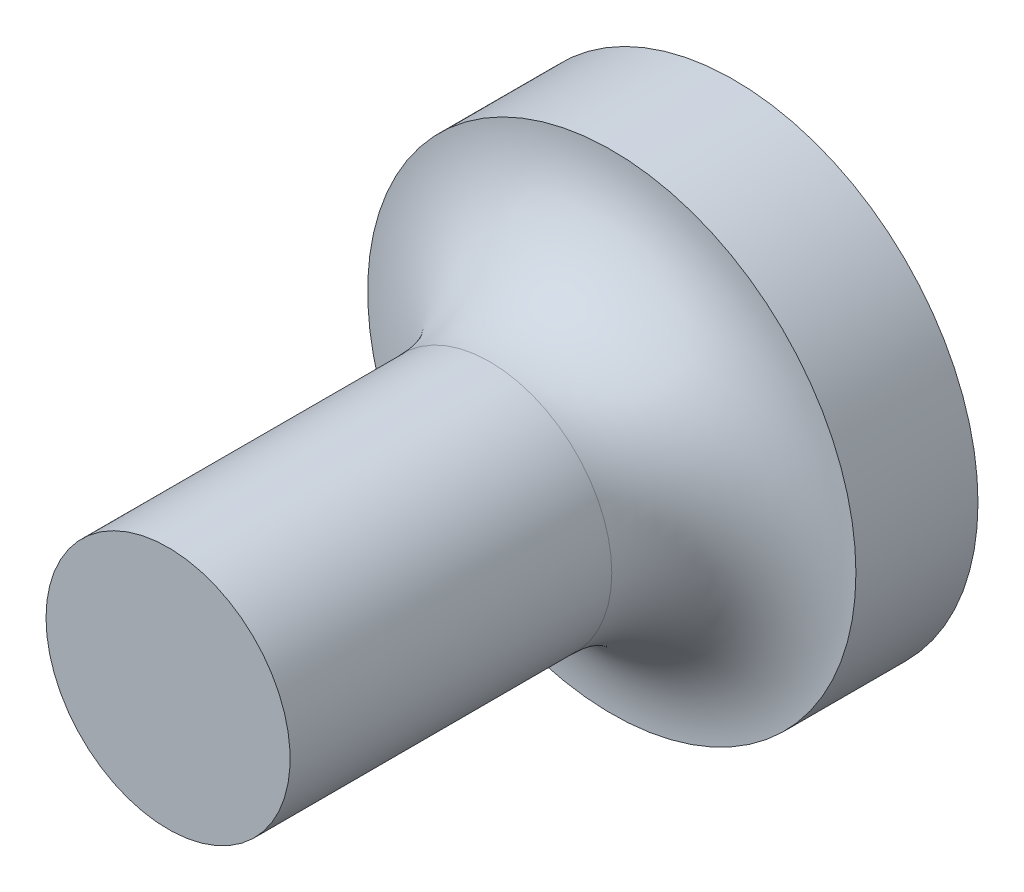
ISO-10303-21;
HEADER;
FILE_DESCRIPTION(('STEP AP214'),'2;1');
FILE_NAME('part.step','',(''),(''),'','','');
FILE_SCHEMA(('AUTOMOTIVE_DESIGN { 1 0 10303 214 1 1 1 1 }'));
ENDSEC;
DATA;
#1=APPLICATION_CONTEXT('core data for automotive mechanical design processes');
#2=APPLICATION_PROTOCOL_DEFINITION('international standard','automotive_design',2000,#1);
#3=PRODUCT_CONTEXT('',#1,'mechanical');
#4=PRODUCT('Part','Part','',(#3));
#5=PRODUCT_RELATED_PRODUCT_CATEGORY('part','',(#4));
#6=PRODUCT_DEFINITION_FORMATION('','',#4);
#7=PRODUCT_DEFINITION_CONTEXT('part definition',#1,'design');
#8=PRODUCT_DEFINITION('design','',#6,#7);
#9=PRODUCT_DEFINITION_SHAPE('','',#8);
#10=(LENGTH_UNIT() NAMED_UNIT(*) SI_UNIT(.MILLI.,.METRE.));
#11=(NAMED_UNIT(*) PLANE_ANGLE_UNIT() SI_UNIT($,.RADIAN.));
#12=(NAMED_UNIT(*) SI_UNIT($,.STERADIAN.) SOLID_ANGLE_UNIT());
#13=UNCERTAINTY_MEASURE_WITH_UNIT(LENGTH_MEASURE(1.E-05),#10,'distance_accuracy_value','');
#14=(GEOMETRIC_REPRESENTATION_CONTEXT(3) GLOBAL_UNCERTAINTY_ASSIGNED_CONTEXT((#13)) GLOBAL_UNIT_ASSIGNED_CONTEXT((#10,
#11,#12)) REPRESENTATION_CONTEXT('',''));
#15=CARTESIAN_POINT('',(0.,0.,0.));
#16=DIRECTION('',(0.,0.,1.));
#17=DIRECTION('',(1.,0.,0.));
#18=AXIS2_PLACEMENT_3D('',#15,#16,#17);
#19=CARTESIAN_POINT('',(0.,0.,52.35));
#20=DIRECTION('',(0.,0.,-1.));
#21=DIRECTION('',(-1.,0.,0.));
#22=AXIS2_PLACEMENT_3D('',#19,#20,#21);
#23=CYLINDRICAL_SURFACE('',#22,10.);
#24=CARTESIAN_POINT('',(0.,0.,26.));
#25=DIRECTION('',(0.,0.,1.));
#26=DIRECTION('',(1.,0.,0.));
#27=AXIS2_PLACEMENT_3D('',#24,#25,#26);
#28=CIRCLE('',#27,10.);
#29=CARTESIAN_POINT('',(-10.,0.,26.));
#30=VERTEX_POINT('',#29);
#31=EDGE_CURVE('E10',#30,#30,#28,.T.);
#32=CARTESIAN_POINT('',(0.,0.,52.35));
#33=DIRECTION('',(0.,0.,1.));
#34=DIRECTION('',(1.,0.,0.));
#35=AXIS2_PLACEMENT_3D('',#32,#33,#34);
#36=CIRCLE('',#35,10.);
#37=CARTESIAN_POINT('',(-10.,0.,52.35));
#38=VERTEX_POINT('',#37);
#39=EDGE_CURVE('E54',#38,#38,#36,.T.);
#40=CARTESIAN_POINT('',(-10.,0.,26.));
#41=CARTESIAN_POINT('',(-10.,0.,26.2744791666667));
#42=CARTESIAN_POINT('',(-10.,0.,26.5489583333333));
#43=CARTESIAN_POINT('',(-10.,0.,27.0979166666667));
#44=CARTESIAN_POINT('',(-10.,0.,27.3723958333333));
#45=CARTESIAN_POINT('',(-10.,0.,27.9213541666667));
#46=CARTESIAN_POINT('',(-10.,0.,28.1958333333333));
#47=CARTESIAN_POINT('',(-10.,0.,28.7447916666667));
#48=CARTESIAN_POINT('',(-10.,0.,29.0192708333333));
#49=CARTESIAN_POINT('',(-10.,0.,29.5682291666667));
#50=CARTESIAN_POINT('',(-10.,0.,29.8427083333333));
#51=CARTESIAN_POINT('',(-10.,0.,30.3916666666667));
#52=CARTESIAN_POINT('',(-10.,0.,30.6661458333333));
#53=CARTESIAN_POINT('',(-10.,0.,31.2151041666667));
#54=CARTESIAN_POINT('',(-10.,0.,31.4895833333333));
#55=CARTESIAN_POINT('',(-10.,0.,32.0385416666667));
#56=CARTESIAN_POINT('',(-10.,0.,32.3130208333333));
#57=CARTESIAN_POINT('',(-10.,0.,32.8619791666667));
#58=CARTESIAN_POINT('',(-10.,0.,33.1364583333333));
#59=CARTESIAN_POINT('',(-10.,0.,33.6854166666667));
#60=CARTESIAN_POINT('',(-10.,0.,33.9598958333333));
#61=CARTESIAN_POINT('',(-10.,0.,34.5088541666667));
#62=CARTESIAN_POINT('',(-10.,0.,34.7833333333333));
#63=CARTESIAN_POINT('',(-10.,0.,35.3322916666667));
#64=CARTESIAN_POINT('',(-10.,0.,35.6067708333333));
#65=CARTESIAN_POINT('',(-10.,0.,36.1557291666667));
#66=CARTESIAN_POINT('',(-10.,0.,36.4302083333333));
#67=CARTESIAN_POINT('',(-10.,0.,36.9791666666667));
#68=CARTESIAN_POINT('',(-10.,0.,37.2536458333333));
#69=CARTESIAN_POINT('',(-10.,0.,37.8026041666667));
#70=CARTESIAN_POINT('',(-10.,0.,38.0770833333333));
#71=CARTESIAN_POINT('',(-10.,0.,38.6260416666667));
#72=CARTESIAN_POINT('',(-10.,0.,38.9005208333333));
#73=CARTESIAN_POINT('',(-10.,0.,39.4494791666667));
#74=CARTESIAN_POINT('',(-10.,0.,39.7239583333333));
#75=CARTESIAN_POINT('',(-10.,0.,40.2729166666667));
#76=CARTESIAN_POINT('',(-10.,0.,40.5473958333333));
#77=CARTESIAN_POINT('',(-10.,0.,41.0963541666667));
#78=CARTESIAN_POINT('',(-10.,0.,41.3708333333333));
#79=CARTESIAN_POINT('',(-10.,0.,41.9197916666667));
#80=CARTESIAN_POINT('',(-10.,0.,42.1942708333333));
#81=CARTESIAN_POINT('',(-10.,0.,42.7432291666667));
#82=CARTESIAN_POINT('',(-10.,0.,43.0177083333333));
#83=CARTESIAN_POINT('',(-10.,0.,43.5666666666667));
#84=CARTESIAN_POINT('',(-10.,0.,43.8411458333333));
#85=CARTESIAN_POINT('',(-10.,0.,44.3901041666667));
#86=CARTESIAN_POINT('',(-10.,0.,44.6645833333333));
#87=CARTESIAN_POINT('',(-10.,0.,45.2135416666667));
#88=CARTESIAN_POINT('',(-10.,0.,45.4880208333333));
#89=CARTESIAN_POINT('',(-10.,0.,46.0369791666667));
#90=CARTESIAN_POINT('',(-10.,0.,46.3114583333333));
#91=CARTESIAN_POINT('',(-10.,0.,46.8604166666667));
#92=CARTESIAN_POINT('',(-10.,0.,47.1348958333333));
#93=CARTESIAN_POINT('',(-10.,0.,47.6838541666667));
#94=CARTESIAN_POINT('',(-10.,0.,47.9583333333333));
#95=CARTESIAN_POINT('',(-10.,0.,48.5072916666667));
#96=CARTESIAN_POINT('',(-10.,0.,48.7817708333333));
#97=CARTESIAN_POINT('',(-10.,0.,49.3307291666667));
#98=CARTESIAN_POINT('',(-10.,0.,49.6052083333333));
#99=CARTESIAN_POINT('',(-10.,0.,50.1541666666667));
#100=CARTESIAN_POINT('',(-10.,0.,50.4286458333333));
#101=CARTESIAN_POINT('',(-10.,0.,50.9776041666667));
#102=CARTESIAN_POINT('',(-10.,0.,51.2520833333333));
#103=CARTESIAN_POINT('',(-10.,0.,51.8010416666667));
#104=CARTESIAN_POINT('',(-10.,0.,52.0755208333333));
#105=CARTESIAN_POINT('',(-10.,0.,52.35));
#106=B_SPLINE_CURVE_WITH_KNOTS('',3,(#40,#41,#42,#43,#44,#45,#46,#47,#48,#49,#50,#51,#52,#53,
#54,#55,#56,#57,#58,#59,#60,#61,#62,#63,#64,#65,#66,#67,#68,#69,#70,#71,#72,#73,#74,#75,#76,#77,
#78,#79,#80,#81,#82,#83,#84,#85,#86,#87,#88,#89,#90,#91,#92,#93,#94,#95,#96,#97,#98,#99,#100,
#101,#102,#103,#104,#105),.UNSPECIFIED.,.F.,.F.,(4,2,2,2,2,2,2,2,2,2,2,2,2,2,2,2,2,2,2,2,2,2,2,
2,2,2,2,2,2,2,2,2,4),(0.,0.823437499999999,1.646875,2.4703125,3.29375,4.1171875,4.940625,
5.7640625,6.5875,7.4109375,8.234375,9.0578125,9.88125,10.7046875,11.528125,12.3515625,13.175,
13.9984375,14.821875,15.6453125,16.46875,17.2921875,18.115625,18.9390625,19.7625,20.5859375,
21.409375,22.2328125,23.05625,23.8796875,24.703125,25.5265625,26.35),.UNSPECIFIED.);
#107=EDGE_CURVE('BSEAM41',#30,#38,#106,.T.);
#108=ORIENTED_EDGE('',*,*,#31,.T.);
#109=ORIENTED_EDGE('',*,*,#39,.F.);
#110=ORIENTED_EDGE('',*,*,#107,.T.);
#111=ORIENTED_EDGE('',*,*,#107,.F.);
#112=EDGE_LOOP('',(#108,#110,#109,#111));
#113=FACE_BOUND('',#112,.T.);
#114=ADVANCED_FACE('F41',(#113),#23,.T.);
#115=CARTESIAN_POINT('',(0.,0.,52.35));
#116=DIRECTION('',(0.,0.,1.));
#117=DIRECTION('',(1.,0.,0.));
#118=AXIS2_PLACEMENT_3D('',#115,#116,#117);
#119=PLANE('',#118);
#120=ORIENTED_EDGE('',*,*,#39,.T.);
#121=EDGE_LOOP('',(#120));
#122=FACE_BOUND('',#121,.T.);
#123=ADVANCED_FACE('F80',(#122),#119,.T.);
#124=CARTESIAN_POINT('',(0.,0.,16.));
#125=DIRECTION('',(0.,0.,-1.));
#126=DIRECTION('',(-1.,0.,0.));
#127=AXIS2_PLACEMENT_3D('',#124,#125,#126);
#128=CYLINDRICAL_SURFACE('',#127,20.);
#129=CARTESIAN_POINT('',(0.,0.,16.));
#130=DIRECTION('',(0.,0.,1.));
#131=DIRECTION('',(1.,0.,0.));
#132=AXIS2_PLACEMENT_3D('',#129,#130,#131);
#133=CIRCLE('',#132,20.);
#134=CARTESIAN_POINT('',(20.,0.,16.));
#135=VERTEX_POINT('',#134);
#136=EDGE_CURVE('E64',#135,#135,#133,.T.);
#137=ORIENTED_EDGE('',*,*,#136,.F.);
#138=EDGE_LOOP('',(#137));
#139=FACE_BOUND('',#138,.T.);
#140=CARTESIAN_POINT('',(0.,0.,6.));
#141=DIRECTION('',(0.,0.,1.));
#142=DIRECTION('',(1.,0.,0.));
#143=AXIS2_PLACEMENT_3D('',#140,#141,#142);
#144=CIRCLE('',#143,20.);
#145=CARTESIAN_POINT('',(20.,0.,6.));
#146=VERTEX_POINT('',#145);
#147=EDGE_CURVE('E66',#146,#146,#144,.T.);
#148=ORIENTED_EDGE('',*,*,#147,.T.);
#149=EDGE_LOOP('',(#148));
#150=FACE_BOUND('',#149,.T.);
#151=ADVANCED_FACE('F76',(#139,#150),#128,.T.);
#152=CARTESIAN_POINT('',(0.,0.,6.));
#153=DIRECTION('',(0.,0.,1.));
#154=DIRECTION('',(1.,0.,0.));
#155=AXIS2_PLACEMENT_3D('',#152,#153,#154);
#156=PLANE('',#155);
#157=CARTESIAN_POINT('',(0.,0.,6.));
#158=DIRECTION('',(0.,0.,1.));
#159=DIRECTION('',(1.,0.,0.));
#160=AXIS2_PLACEMENT_3D('',#157,#158,#159);
#161=CIRCLE('',#160,10.);
#162=CARTESIAN_POINT('',(-10.,0.,5.99999999999999));
#163=VERTEX_POINT('',#162);
#164=EDGE_CURVE('E49',#163,#163,#161,.T.);
#165=ORIENTED_EDGE('',*,*,#164,.T.);
#166=EDGE_LOOP('',(#165));
#167=FACE_BOUND('',#166,.T.);
#168=ORIENTED_EDGE('',*,*,#147,.F.);
#169=EDGE_LOOP('',(#168));
#170=FACE_BOUND('',#169,.T.);
#171=ADVANCED_FACE('F79',(#167,#170),#156,.F.);
#172=CARTESIAN_POINT('',(0.,0.,0.));
#173=DIRECTION('',(0.,0.,1.));
#174=DIRECTION('',(1.,0.,0.));
#175=AXIS2_PLACEMENT_3D('',#172,#173,#174);
#176=PLANE('',#175);
#177=CARTESIAN_POINT('',(0.,0.,0.));
#178=DIRECTION('',(0.,0.,1.));
#179=DIRECTION('',(1.,0.,0.));
#180=AXIS2_PLACEMENT_3D('',#177,#178,#179);
#181=CIRCLE('',#180,10.);
#182=CARTESIAN_POINT('',(-10.,0.,0.));
#183=VERTEX_POINT('',#182);
#184=EDGE_CURVE('E59',#183,#183,#181,.T.);
#185=ORIENTED_EDGE('',*,*,#184,.F.);
#186=EDGE_LOOP('',(#185));
#187=FACE_BOUND('',#186,.T.);
#188=ADVANCED_FACE('F85',(#187),#176,.F.);
#189=CARTESIAN_POINT('',(-10.,0.,0.));
#190=CARTESIAN_POINT('',(-10.,0.,0.0625000000000001));
#191=CARTESIAN_POINT('',(-10.,0.,0.125));
#192=CARTESIAN_POINT('',(-10.,0.,0.25));
#193=CARTESIAN_POINT('',(-10.,0.,0.3125));
#194=CARTESIAN_POINT('',(-10.,0.,0.4375));
#195=CARTESIAN_POINT('',(-10.,0.,0.5));
#196=CARTESIAN_POINT('',(-10.,0.,0.625000000000001));
#197=CARTESIAN_POINT('',(-10.,0.,0.687500000000001));
#198=CARTESIAN_POINT('',(-10.,0.,0.812500000000001));
#199=CARTESIAN_POINT('',(-10.,0.,0.875000000000001));
#200=CARTESIAN_POINT('',(-10.,0.,1.));
#201=CARTESIAN_POINT('',(-10.,0.,1.0625));
#202=CARTESIAN_POINT('',(-10.,0.,1.1875));
#203=CARTESIAN_POINT('',(-10.,0.,1.25));
#204=CARTESIAN_POINT('',(-10.,0.,1.375));
#205=CARTESIAN_POINT('',(-10.,0.,1.4375));
#206=CARTESIAN_POINT('',(-10.,0.,1.5625));
#207=CARTESIAN_POINT('',(-10.,0.,1.625));
#208=CARTESIAN_POINT('',(-10.,0.,1.74999999999999));
#209=CARTESIAN_POINT('',(-10.,0.,1.81249999999999));
#210=CARTESIAN_POINT('',(-10.,0.,1.93749999999999));
#211=CARTESIAN_POINT('',(-10.,0.,1.99999999999999));
#212=CARTESIAN_POINT('',(-10.,0.,2.125));
#213=CARTESIAN_POINT('',(-10.,0.,2.1875));
#214=CARTESIAN_POINT('',(-10.,0.,2.3125));
#215=CARTESIAN_POINT('',(-10.,0.,2.375));
#216=CARTESIAN_POINT('',(-10.,0.,2.5));
#217=CARTESIAN_POINT('',(-10.,0.,2.5625));
#218=CARTESIAN_POINT('',(-10.,0.,2.6875));
#219=CARTESIAN_POINT('',(-10.,0.,2.75));
#220=CARTESIAN_POINT('',(-10.,0.,2.875));
#221=CARTESIAN_POINT('',(-10.,0.,2.9375));
#222=CARTESIAN_POINT('',(-10.,0.,3.0625));
#223=CARTESIAN_POINT('',(-10.,0.,3.125));
#224=CARTESIAN_POINT('',(-10.,0.,3.25));
#225=CARTESIAN_POINT('',(-10.,0.,3.3125));
#226=CARTESIAN_POINT('',(-10.,0.,3.4375));
#227=CARTESIAN_POINT('',(-10.,0.,3.5));
#228=CARTESIAN_POINT('',(-10.,0.,3.625));
#229=CARTESIAN_POINT('',(-10.,0.,3.6875));
#230=CARTESIAN_POINT('',(-10.,0.,3.8125));
#231=CARTESIAN_POINT('',(-10.,0.,3.875));
#232=CARTESIAN_POINT('',(-10.,0.,4.));
#233=CARTESIAN_POINT('',(-10.,0.,4.0625));
#234=CARTESIAN_POINT('',(-10.,0.,4.1875));
#235=CARTESIAN_POINT('',(-10.,0.,4.25));
#236=CARTESIAN_POINT('',(-10.,0.,4.37499999999999));
#237=CARTESIAN_POINT('',(-10.,0.,4.43749999999999));
#238=CARTESIAN_POINT('',(-10.,0.,4.56249999999999));
#239=CARTESIAN_POINT('',(-10.,0.,4.62499999999999));
#240=CARTESIAN_POINT('',(-10.,0.,4.74999999999999));
#241=CARTESIAN_POINT('',(-10.,0.,4.81249999999999));
#242=CARTESIAN_POINT('',(-10.,0.,4.93749999999999));
#243=CARTESIAN_POINT('',(-10.,0.,4.99999999999999));
#244=CARTESIAN_POINT('',(-10.,0.,5.12499999999999));
#245=CARTESIAN_POINT('',(-10.,0.,5.18749999999999));
#246=CARTESIAN_POINT('',(-10.,0.,5.31249999999999));
#247=CARTESIAN_POINT('',(-10.,0.,5.37499999999999));
#248=CARTESIAN_POINT('',(-10.,0.,5.49999999999999));
#249=CARTESIAN_POINT('',(-10.,0.,5.56249999999999));
#250=CARTESIAN_POINT('',(-10.,0.,5.68749999999999));
#251=CARTESIAN_POINT('',(-10.,0.,5.74999999999999));
#252=CARTESIAN_POINT('',(-10.,0.,5.87499999999999));
#253=CARTESIAN_POINT('',(-10.,0.,5.93749999999999));
#254=CARTESIAN_POINT('',(-10.,0.,5.99999999999999));
#255=B_SPLINE_CURVE_WITH_KNOTS('',3,(#189,#190,#191,#192,#193,#194,#195,#196,#197,#198,#199,
#200,#201,#202,#203,#204,#205,#206,#207,#208,#209,#210,#211,#212,#213,#214,#215,#216,#217,#218,
#219,#220,#221,#222,#223,#224,#225,#226,#227,#228,#229,#230,#231,#232,#233,#234,#235,#236,#237,
#238,#239,#240,#241,#242,#243,#244,#245,#246,#247,#248,#249,#250,#251,#252,#253,#254),
.UNSPECIFIED.,.F.,.F.,(4,2,2,2,2,2,2,2,2,2,2,2,2,2,2,2,2,2,2,2,2,2,2,2,2,2,2,2,2,2,2,2,4),(0.,
0.1875,0.375,0.5625,0.750000000000001,0.937500000000001,1.125,1.3125,1.5,1.68749999999999,
1.87499999999999,2.06249999999999,2.25,2.4375,2.625,2.8125,3.,3.1875,3.375,3.5625,3.75,3.9375,
4.125,4.3125,4.49999999999999,4.6875,4.87499999999999,5.06249999999999,5.24999999999999,
5.43749999999999,5.62499999999999,5.81249999999999,5.99999999999999),.UNSPECIFIED.);
#256=EDGE_CURVE('BSEAM90',#183,#163,#255,.T.);
#257=ORIENTED_EDGE('',*,*,#184,.T.);
#258=ORIENTED_EDGE('',*,*,#164,.F.);
#259=ORIENTED_EDGE('',*,*,#256,.T.);
#260=ORIENTED_EDGE('',*,*,#256,.F.);
#261=EDGE_LOOP('',(#257,#259,#258,#260));
#262=FACE_BOUND('',#261,.T.);
#263=ADVANCED_FACE('F90',(#262),#23,.T.);
#264=CARTESIAN_POINT('',(0.,0.,26.));
#265=DIRECTION('',(0.,0.,1.));
#266=DIRECTION('',(1.,0.,0.));
#267=AXIS2_PLACEMENT_3D('',#264,#265,#266);
#268=TOROIDAL_SURFACE('',#267,20.,10.);
#269=ORIENTED_EDGE('',*,*,#136,.T.);
#270=EDGE_LOOP('',(#269));
#271=FACE_BOUND('',#270,.T.);
#272=ORIENTED_EDGE('',*,*,#31,.F.);
#273=EDGE_LOOP('',(#272));
#274=FACE_BOUND('',#273,.T.);
#275=ADVANCED_FACE('F43',(#271,#274),#268,.F.);
#276=CLOSED_SHELL('',(#114,#123,#151,#171,#188,#263,#275));
#277=MANIFOLD_SOLID_BREP('B2',#276);
#278=ADVANCED_BREP_SHAPE_REPRESENTATION('',(#18,#277),#14);
#279=SHAPE_DEFINITION_REPRESENTATION(#9,#278);
ENDSEC;
END-ISO-10303-21;
